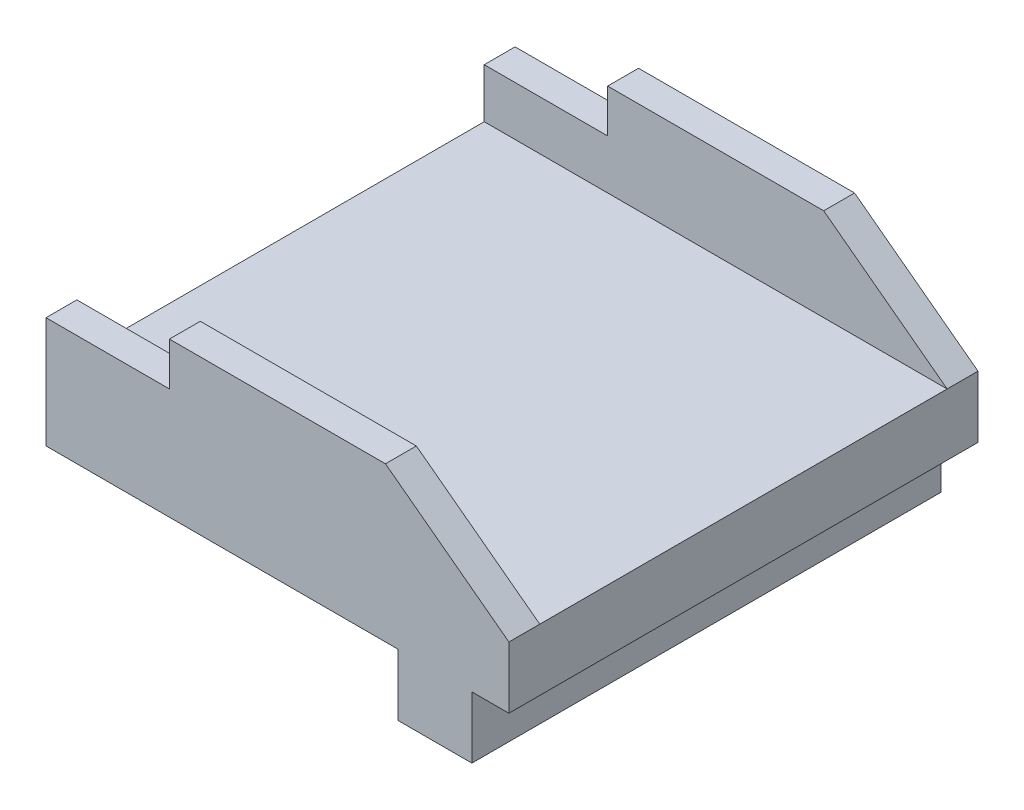
ISO-10303-21;
HEADER;
FILE_DESCRIPTION(('STEP AP214'),'2;1');
FILE_NAME('part.step','',(''),(''),'','','');
FILE_SCHEMA(('AUTOMOTIVE_DESIGN { 1 0 10303 214 1 1 1 1 }'));
ENDSEC;
DATA;
#1=APPLICATION_CONTEXT('core data for automotive mechanical design processes');
#2=APPLICATION_PROTOCOL_DEFINITION('international standard','automotive_design',2000,#1);
#3=PRODUCT_CONTEXT('',#1,'mechanical');
#4=PRODUCT('Part','Part','',(#3));
#5=PRODUCT_RELATED_PRODUCT_CATEGORY('part','',(#4));
#6=PRODUCT_DEFINITION_FORMATION('','',#4);
#7=PRODUCT_DEFINITION_CONTEXT('part definition',#1,'design');
#8=PRODUCT_DEFINITION('design','',#6,#7);
#9=PRODUCT_DEFINITION_SHAPE('','',#8);
#10=(LENGTH_UNIT() NAMED_UNIT(*) SI_UNIT(.MILLI.,.METRE.));
#11=(NAMED_UNIT(*) PLANE_ANGLE_UNIT() SI_UNIT($,.RADIAN.));
#12=(NAMED_UNIT(*) SI_UNIT($,.STERADIAN.) SOLID_ANGLE_UNIT());
#13=UNCERTAINTY_MEASURE_WITH_UNIT(LENGTH_MEASURE(1.E-05),#10,'distance_accuracy_value','');
#14=(GEOMETRIC_REPRESENTATION_CONTEXT(3) GLOBAL_UNCERTAINTY_ASSIGNED_CONTEXT((#13)) GLOBAL_UNIT_ASSIGNED_CONTEXT((#10,
#11,#12)) REPRESENTATION_CONTEXT('',''));
#15=CARTESIAN_POINT('',(0.,0.,0.));
#16=DIRECTION('',(0.,0.,1.));
#17=DIRECTION('',(1.,0.,0.));
#18=AXIS2_PLACEMENT_3D('',#15,#16,#17);
#19=CARTESIAN_POINT('',(14.7,19.6,76.0000000000001));
#20=DIRECTION('',(0.6,0.8,0.));
#21=DIRECTION('',(-0.8,0.6,0.));
#22=AXIS2_PLACEMENT_3D('',#19,#20,#21);
#23=PLANE('',#22);
#24=DIRECTION('',(-0.8,0.6,0.));
#25=VECTOR('',#24,1.);
#26=CARTESIAN_POINT('',(14.7,19.6,5.));
#27=LINE('',#26,#25);
#28=CARTESIAN_POINT('',(37.5,2.5,5.));
#29=VERTEX_POINT('',#28);
#30=CARTESIAN_POINT('',(17.5,17.5,5.));
#31=VERTEX_POINT('',#30);
#32=EDGE_CURVE('E171',#29,#31,#27,.T.);
#33=ORIENTED_EDGE('',*,*,#32,.F.);
#34=DIRECTION('',(0.,0.,-1.));
#35=VECTOR('',#34,1.);
#36=CARTESIAN_POINT('',(37.5,2.5,76.0000000000001));
#37=LINE('',#36,#35);
#38=CARTESIAN_POINT('',(37.5,2.5,0.));
#39=VERTEX_POINT('',#38);
#40=EDGE_CURVE('E215',#29,#39,#37,.T.);
#41=ORIENTED_EDGE('',*,*,#40,.T.);
#42=DIRECTION('',(0.8,-0.6,0.));
#43=VECTOR('',#42,1.);
#44=CARTESIAN_POINT('',(14.7,19.6,0.));
#45=LINE('',#44,#43);
#46=CARTESIAN_POINT('',(17.5,17.5,0.));
#47=VERTEX_POINT('',#46);
#48=EDGE_CURVE('E180',#47,#39,#45,.T.);
#49=ORIENTED_EDGE('',*,*,#48,.F.);
#50=DIRECTION('',(0.,0.,-1.));
#51=VECTOR('',#50,1.);
#52=CARTESIAN_POINT('',(17.5,17.5,76.0000000000001));
#53=LINE('',#52,#51);
#54=EDGE_CURVE('E211',#31,#47,#53,.T.);
#55=ORIENTED_EDGE('',*,*,#54,.F.);
#56=EDGE_LOOP('',(#33,#41,#49,#55));
#57=FACE_BOUND('',#56,.T.);
#58=ADVANCED_FACE('F36',(#57),#23,.T.);
#59=CARTESIAN_POINT('',(0.,17.5,76.0000000000001));
#60=DIRECTION('',(0.,1.,0.));
#61=DIRECTION('',(0.,0.,1.));
#62=AXIS2_PLACEMENT_3D('',#59,#60,#61);
#63=PLANE('',#62);
#64=DIRECTION('',(1.,0.,0.));
#65=VECTOR('',#64,1.);
#66=CARTESIAN_POINT('',(-37.5,17.5,5.));
#67=LINE('',#66,#65);
#68=CARTESIAN_POINT('',(-17.5,17.5,5.));
#69=VERTEX_POINT('',#68);
#70=EDGE_CURVE('E250',#69,#31,#67,.T.);
#71=ORIENTED_EDGE('',*,*,#70,.T.);
#72=ORIENTED_EDGE('',*,*,#54,.T.);
#73=DIRECTION('',(1.,0.,0.));
#74=VECTOR('',#73,1.);
#75=CARTESIAN_POINT('',(0.,17.5,0.));
#76=LINE('',#75,#74);
#77=CARTESIAN_POINT('',(-17.5,17.5,0.));
#78=VERTEX_POINT('',#77);
#79=EDGE_CURVE('E183',#78,#47,#76,.T.);
#80=ORIENTED_EDGE('',*,*,#79,.F.);
#81=DIRECTION('',(0.,0.,-1.));
#82=VECTOR('',#81,1.);
#83=CARTESIAN_POINT('',(-17.5,17.5,76.0000000000001));
#84=LINE('',#83,#82);
#85=EDGE_CURVE('E207',#69,#78,#84,.T.);
#86=ORIENTED_EDGE('',*,*,#85,.F.);
#87=EDGE_LOOP('',(#71,#72,#80,#86));
#88=FACE_BOUND('',#87,.T.);
#89=ADVANCED_FACE('F247',(#88),#63,.T.);
#90=CARTESIAN_POINT('',(-17.5,0.,76.0000000000001));
#91=DIRECTION('',(1.,0.,0.));
#92=DIRECTION('',(0.,1.,0.));
#93=AXIS2_PLACEMENT_3D('',#90,#91,#92);
#94=PLANE('',#93);
#95=DIRECTION('',(0.,0.,-1.));
#96=VECTOR('',#95,1.);
#97=CARTESIAN_POINT('',(-17.5,10.5,76.0000000000001));
#98=LINE('',#97,#96);
#99=CARTESIAN_POINT('',(-17.5,10.5,5.));
#100=VERTEX_POINT('',#99);
#101=CARTESIAN_POINT('',(-17.5,10.5,0.));
#102=VERTEX_POINT('',#101);
#103=EDGE_CURVE('E203',#100,#102,#98,.T.);
#104=ORIENTED_EDGE('',*,*,#103,.F.);
#105=DIRECTION('',(0.,1.,0.));
#106=VECTOR('',#105,1.);
#107=CARTESIAN_POINT('',(-17.5,0.,5.));
#108=LINE('',#107,#106);
#109=EDGE_CURVE('E244',#100,#69,#108,.T.);
#110=ORIENTED_EDGE('',*,*,#109,.T.);
#111=ORIENTED_EDGE('',*,*,#85,.T.);
#112=DIRECTION('',(0.,-1.,0.));
#113=VECTOR('',#112,1.);
#114=CARTESIAN_POINT('',(-17.5,0.,0.));
#115=LINE('',#114,#113);
#116=EDGE_CURVE('E186',#78,#102,#115,.T.);
#117=ORIENTED_EDGE('',*,*,#116,.T.);
#118=EDGE_LOOP('',(#104,#110,#111,#117));
#119=FACE_BOUND('',#118,.T.);
#120=ADVANCED_FACE('F240',(#119),#94,.F.);
#121=CARTESIAN_POINT('',(0.,10.5,76.0000000000001));
#122=DIRECTION('',(0.,1.,0.));
#123=DIRECTION('',(0.,0.,1.));
#124=AXIS2_PLACEMENT_3D('',#121,#122,#123);
#125=PLANE('',#124);
#126=DIRECTION('',(-1.,0.,0.));
#127=VECTOR('',#126,1.);
#128=CARTESIAN_POINT('',(0.,10.5,5.));
#129=LINE('',#128,#127);
#130=CARTESIAN_POINT('',(-37.5,10.5,5.));
#131=VERTEX_POINT('',#130);
#132=EDGE_CURVE('E237',#100,#131,#129,.T.);
#133=ORIENTED_EDGE('',*,*,#132,.F.);
#134=ORIENTED_EDGE('',*,*,#103,.T.);
#135=DIRECTION('',(1.,0.,0.));
#136=VECTOR('',#135,1.);
#137=CARTESIAN_POINT('',(0.,10.5,0.));
#138=LINE('',#137,#136);
#139=CARTESIAN_POINT('',(-37.5,10.5,0.));
#140=VERTEX_POINT('',#139);
#141=EDGE_CURVE('E189',#140,#102,#138,.T.);
#142=ORIENTED_EDGE('',*,*,#141,.F.);
#143=DIRECTION('',(0.,0.,-1.));
#144=VECTOR('',#143,1.);
#145=CARTESIAN_POINT('',(-37.5,10.5,76.0000000000001));
#146=LINE('',#145,#144);
#147=EDGE_CURVE('E148',#131,#140,#146,.T.);
#148=ORIENTED_EDGE('',*,*,#147,.F.);
#149=EDGE_LOOP('',(#133,#134,#142,#148));
#150=FACE_BOUND('',#149,.T.);
#151=ADVANCED_FACE('F233',(#150),#125,.T.);
#152=CARTESIAN_POINT('',(0.,-17.5,76.0000000000001));
#153=DIRECTION('',(0.,1.,0.));
#154=DIRECTION('',(-1.,0.,0.));
#155=AXIS2_PLACEMENT_3D('',#152,#153,#154);
#156=PLANE('',#155);
#157=DIRECTION('',(1.,0.,0.));
#158=VECTOR('',#157,1.);
#159=CARTESIAN_POINT('',(0.,-17.5,0.));
#160=LINE('',#159,#158);
#161=CARTESIAN_POINT('',(19.5,-17.5,0.));
#162=VERTEX_POINT('',#161);
#163=CARTESIAN_POINT('',(31.5,-17.5,0.));
#164=VERTEX_POINT('',#163);
#165=EDGE_CURVE('E168',#162,#164,#160,.T.);
#166=ORIENTED_EDGE('',*,*,#165,.T.);
#167=DIRECTION('',(0.,0.,-1.));
#168=VECTOR('',#167,1.);
#169=CARTESIAN_POINT('',(31.5,-17.5,76.0000000000001));
#170=LINE('',#169,#168);
#171=CARTESIAN_POINT('',(31.5,-17.5,76.0000000000001));
#172=VERTEX_POINT('',#171);
#173=EDGE_CURVE('E44',#172,#164,#170,.T.);
#174=ORIENTED_EDGE('',*,*,#173,.F.);
#175=DIRECTION('',(1.,0.,0.));
#176=VECTOR('',#175,1.);
#177=CARTESIAN_POINT('',(0.,-17.5,76.0000000000001));
#178=LINE('',#177,#176);
#179=CARTESIAN_POINT('',(19.5,-17.5,76.0000000000001));
#180=VERTEX_POINT('',#179);
#181=EDGE_CURVE('E198',#180,#172,#178,.T.);
#182=ORIENTED_EDGE('',*,*,#181,.F.);
#183=DIRECTION('',(0.,0.,-1.));
#184=VECTOR('',#183,1.);
#185=CARTESIAN_POINT('',(19.5,-17.5,76.0000000000001));
#186=LINE('',#185,#184);
#187=EDGE_CURVE('E60',#180,#162,#186,.T.);
#188=ORIENTED_EDGE('',*,*,#187,.T.);
#189=EDGE_LOOP('',(#166,#174,#182,#188));
#190=FACE_BOUND('',#189,.T.);
#191=ADVANCED_FACE('F38',(#190),#156,.F.);
#192=CARTESIAN_POINT('',(31.5,0.,76.0000000000001));
#193=DIRECTION('',(-1.,0.,0.));
#194=DIRECTION('',(0.,0.,1.));
#195=AXIS2_PLACEMENT_3D('',#192,#193,#194);
#196=PLANE('',#195);
#197=DIRECTION('',(0.,1.,0.));
#198=VECTOR('',#197,1.);
#199=CARTESIAN_POINT('',(31.5,0.,0.));
#200=LINE('',#199,#198);
#201=CARTESIAN_POINT('',(31.5,-7.50000000000001,0.));
#202=VERTEX_POINT('',#201);
#203=EDGE_CURVE('E170',#164,#202,#200,.T.);
#204=ORIENTED_EDGE('',*,*,#203,.T.);
#205=DIRECTION('',(0.,0.,-1.));
#206=VECTOR('',#205,1.);
#207=CARTESIAN_POINT('',(31.5,-7.50000000000001,76.0000000000001));
#208=LINE('',#207,#206);
#209=CARTESIAN_POINT('',(31.5,-7.50000000000001,76.0000000000001));
#210=VERTEX_POINT('',#209);
#211=EDGE_CURVE('E221',#210,#202,#208,.T.);
#212=ORIENTED_EDGE('',*,*,#211,.F.);
#213=DIRECTION('',(0.,1.,0.));
#214=VECTOR('',#213,1.);
#215=CARTESIAN_POINT('',(31.5,0.,76.0000000000001));
#216=LINE('',#215,#214);
#217=EDGE_CURVE('E109',#172,#210,#216,.T.);
#218=ORIENTED_EDGE('',*,*,#217,.F.);
#219=ORIENTED_EDGE('',*,*,#173,.T.);
#220=EDGE_LOOP('',(#204,#212,#218,#219));
#221=FACE_BOUND('',#220,.T.);
#222=ADVANCED_FACE('F223',(#221),#196,.F.);
#223=CARTESIAN_POINT('',(0.,-7.50000000000001,76.0000000000001));
#224=DIRECTION('',(0.,-1.,0.));
#225=DIRECTION('',(0.,0.,-1.));
#226=AXIS2_PLACEMENT_3D('',#223,#224,#225);
#227=PLANE('',#226);
#228=DIRECTION('',(-1.,0.,0.));
#229=VECTOR('',#228,1.);
#230=CARTESIAN_POINT('',(0.,-7.50000000000001,0.));
#231=LINE('',#230,#229);
#232=CARTESIAN_POINT('',(37.5,-7.50000000000001,0.));
#233=VERTEX_POINT('',#232);
#234=EDGE_CURVE('E174',#233,#202,#231,.T.);
#235=ORIENTED_EDGE('',*,*,#234,.F.);
#236=DIRECTION('',(0.,0.,-1.));
#237=VECTOR('',#236,1.);
#238=CARTESIAN_POINT('',(37.5,-7.50000000000001,76.0000000000001));
#239=LINE('',#238,#237);
#240=CARTESIAN_POINT('',(37.5,-7.50000000000001,76.0000000000001));
#241=VERTEX_POINT('',#240);
#242=EDGE_CURVE('E219',#241,#233,#239,.T.);
#243=ORIENTED_EDGE('',*,*,#242,.F.);
#244=DIRECTION('',(-1.,0.,0.));
#245=VECTOR('',#244,1.);
#246=CARTESIAN_POINT('',(0.,-7.50000000000001,76.0000000000001));
#247=LINE('',#246,#245);
#248=EDGE_CURVE('E307',#241,#210,#247,.T.);
#249=ORIENTED_EDGE('',*,*,#248,.T.);
#250=ORIENTED_EDGE('',*,*,#211,.T.);
#251=EDGE_LOOP('',(#235,#243,#249,#250));
#252=FACE_BOUND('',#251,.T.);
#253=ADVANCED_FACE('F356',(#252),#227,.T.);
#254=CARTESIAN_POINT('',(37.5,0.,76.0000000000001));
#255=DIRECTION('',(-1.,0.,0.));
#256=DIRECTION('',(0.,0.,1.));
#257=AXIS2_PLACEMENT_3D('',#254,#255,#256);
#258=PLANE('',#257);
#259=DIRECTION('',(0.,1.,0.));
#260=VECTOR('',#259,1.);
#261=CARTESIAN_POINT('',(37.5,0.,0.));
#262=LINE('',#261,#260);
#263=EDGE_CURVE('E177',#233,#39,#262,.T.);
#264=ORIENTED_EDGE('',*,*,#263,.T.);
#265=ORIENTED_EDGE('',*,*,#40,.F.);
#266=DIRECTION('',(0.,0.,-1.));
#267=VECTOR('',#266,1.);
#268=CARTESIAN_POINT('',(37.5,2.5,71.));
#269=LINE('',#268,#267);
#270=CARTESIAN_POINT('',(37.5,2.5,71.));
#271=VERTEX_POINT('',#270);
#272=EDGE_CURVE('E280',#271,#29,#269,.T.);
#273=ORIENTED_EDGE('',*,*,#272,.F.);
#274=CARTESIAN_POINT('',(37.5,2.5,76.0000000000001));
#275=VERTEX_POINT('',#274);
#276=EDGE_CURVE('E216',#275,#271,#37,.T.);
#277=ORIENTED_EDGE('',*,*,#276,.F.);
#278=DIRECTION('',(0.,1.,0.));
#279=VECTOR('',#278,1.);
#280=CARTESIAN_POINT('',(37.5,0.,76.0000000000001));
#281=LINE('',#280,#279);
#282=EDGE_CURVE('E310',#241,#275,#281,.T.);
#283=ORIENTED_EDGE('',*,*,#282,.F.);
#284=ORIENTED_EDGE('',*,*,#242,.T.);
#285=EDGE_LOOP('',(#264,#265,#273,#277,#283,#284));
#286=FACE_BOUND('',#285,.T.);
#287=ADVANCED_FACE('F333',(#286),#258,.F.);
#288=DIRECTION('',(0.8,-0.6,0.));
#289=VECTOR('',#288,1.);
#290=CARTESIAN_POINT('',(14.7,19.6,71.0000000000001));
#291=LINE('',#290,#289);
#292=CARTESIAN_POINT('',(17.5,17.5,71.0000000000001));
#293=VERTEX_POINT('',#292);
#294=EDGE_CURVE('E300',#293,#271,#291,.T.);
#295=ORIENTED_EDGE('',*,*,#294,.F.);
#296=CARTESIAN_POINT('',(17.5,17.5,76.0000000000001));
#297=VERTEX_POINT('',#296);
#298=EDGE_CURVE('E212',#297,#293,#53,.T.);
#299=ORIENTED_EDGE('',*,*,#298,.F.);
#300=DIRECTION('',(0.8,-0.6,0.));
#301=VECTOR('',#300,1.);
#302=CARTESIAN_POINT('',(14.7,19.6,76.0000000000001));
#303=LINE('',#302,#301);
#304=EDGE_CURVE('E312',#297,#275,#303,.T.);
#305=ORIENTED_EDGE('',*,*,#304,.T.);
#306=ORIENTED_EDGE('',*,*,#276,.T.);
#307=EDGE_LOOP('',(#295,#299,#305,#306));
#308=FACE_BOUND('',#307,.T.);
#309=ADVANCED_FACE('F336',(#308),#23,.T.);
#310=DIRECTION('',(1.,0.,0.));
#311=VECTOR('',#310,1.);
#312=CARTESIAN_POINT('',(-37.5,17.5,71.0000000000001));
#313=LINE('',#312,#311);
#314=CARTESIAN_POINT('',(-17.5,17.5,71.0000000000001));
#315=VERTEX_POINT('',#314);
#316=EDGE_CURVE('E290',#315,#293,#313,.T.);
#317=ORIENTED_EDGE('',*,*,#316,.F.);
#318=CARTESIAN_POINT('',(-17.5,17.5,76.0000000000001));
#319=VERTEX_POINT('',#318);
#320=EDGE_CURVE('E208',#319,#315,#84,.T.);
#321=ORIENTED_EDGE('',*,*,#320,.F.);
#322=DIRECTION('',(1.,0.,0.));
#323=VECTOR('',#322,1.);
#324=CARTESIAN_POINT('',(0.,17.5,76.0000000000001));
#325=LINE('',#324,#323);
#326=EDGE_CURVE('E315',#319,#297,#325,.T.);
#327=ORIENTED_EDGE('',*,*,#326,.T.);
#328=ORIENTED_EDGE('',*,*,#298,.T.);
#329=EDGE_LOOP('',(#317,#321,#327,#328));
#330=FACE_BOUND('',#329,.T.);
#331=ADVANCED_FACE('F339',(#330),#63,.T.);
#332=ORIENTED_EDGE('',*,*,#320,.T.);
#333=DIRECTION('',(0.,-1.,0.));
#334=VECTOR('',#333,1.);
#335=CARTESIAN_POINT('',(-17.5,0.,71.));
#336=LINE('',#335,#334);
#337=CARTESIAN_POINT('',(-17.5,10.5,71.));
#338=VERTEX_POINT('',#337);
#339=EDGE_CURVE('E297',#315,#338,#336,.T.);
#340=ORIENTED_EDGE('',*,*,#339,.T.);
#341=CARTESIAN_POINT('',(-17.5,10.5,76.0000000000001));
#342=VERTEX_POINT('',#341);
#343=EDGE_CURVE('E204',#342,#338,#98,.T.);
#344=ORIENTED_EDGE('',*,*,#343,.F.);
#345=DIRECTION('',(0.,-1.,0.));
#346=VECTOR('',#345,1.);
#347=CARTESIAN_POINT('',(-17.5,0.,76.0000000000001));
#348=LINE('',#347,#346);
#349=EDGE_CURVE('E163',#319,#342,#348,.T.);
#350=ORIENTED_EDGE('',*,*,#349,.F.);
#351=EDGE_LOOP('',(#332,#340,#344,#350));
#352=FACE_BOUND('',#351,.T.);
#353=ADVANCED_FACE('F322',(#352),#94,.F.);
#354=DIRECTION('',(1.,0.,0.));
#355=VECTOR('',#354,1.);
#356=CARTESIAN_POINT('',(0.,10.5,71.));
#357=LINE('',#356,#355);
#358=CARTESIAN_POINT('',(-37.5,10.5,71.));
#359=VERTEX_POINT('',#358);
#360=EDGE_CURVE('E282',#359,#338,#357,.T.);
#361=ORIENTED_EDGE('',*,*,#360,.F.);
#362=CARTESIAN_POINT('',(-37.5,10.5,76.0000000000001));
#363=VERTEX_POINT('',#362);
#364=EDGE_CURVE('E201',#363,#359,#146,.T.);
#365=ORIENTED_EDGE('',*,*,#364,.F.);
#366=DIRECTION('',(1.,0.,0.));
#367=VECTOR('',#366,1.);
#368=CARTESIAN_POINT('',(0.,10.5,76.0000000000001));
#369=LINE('',#368,#367);
#370=EDGE_CURVE('E161',#363,#342,#369,.T.);
#371=ORIENTED_EDGE('',*,*,#370,.T.);
#372=ORIENTED_EDGE('',*,*,#343,.T.);
#373=EDGE_LOOP('',(#361,#365,#371,#372));
#374=FACE_BOUND('',#373,.T.);
#375=ADVANCED_FACE('F325',(#374),#125,.T.);
#376=CARTESIAN_POINT('',(-37.5,0.,76.0000000000001));
#377=DIRECTION('',(-1.,0.,0.));
#378=DIRECTION('',(0.,-1.,0.));
#379=AXIS2_PLACEMENT_3D('',#376,#377,#378);
#380=PLANE('',#379);
#381=DIRECTION('',(0.,1.,0.));
#382=VECTOR('',#381,1.);
#383=CARTESIAN_POINT('',(-37.5,2.5,5.));
#384=LINE('',#383,#382);
#385=CARTESIAN_POINT('',(-37.5,2.5,5.));
#386=VERTEX_POINT('',#385);
#387=EDGE_CURVE('E285',#386,#131,#384,.T.);
#388=ORIENTED_EDGE('',*,*,#387,.T.);
#389=ORIENTED_EDGE('',*,*,#147,.T.);
#390=DIRECTION('',(0.,1.,0.));
#391=VECTOR('',#390,1.);
#392=CARTESIAN_POINT('',(-37.5,0.,0.));
#393=LINE('',#392,#391);
#394=CARTESIAN_POINT('',(-37.5,-7.50000000000001,0.));
#395=VERTEX_POINT('',#394);
#396=EDGE_CURVE('E144',#395,#140,#393,.T.);
#397=ORIENTED_EDGE('',*,*,#396,.F.);
#398=DIRECTION('',(0.,0.,-1.));
#399=VECTOR('',#398,1.);
#400=CARTESIAN_POINT('',(-37.5,-7.50000000000001,76.0000000000001));
#401=LINE('',#400,#399);
#402=CARTESIAN_POINT('',(-37.5,-7.50000000000001,76.0000000000001));
#403=VERTEX_POINT('',#402);
#404=EDGE_CURVE('E136',#403,#395,#401,.T.);
#405=ORIENTED_EDGE('',*,*,#404,.F.);
#406=DIRECTION('',(0.,1.,0.));
#407=VECTOR('',#406,1.);
#408=CARTESIAN_POINT('',(-37.5,0.,76.0000000000001));
#409=LINE('',#408,#407);
#410=EDGE_CURVE('E142',#403,#363,#409,.T.);
#411=ORIENTED_EDGE('',*,*,#410,.T.);
#412=ORIENTED_EDGE('',*,*,#364,.T.);
#413=DIRECTION('',(0.,1.,0.));
#414=VECTOR('',#413,1.);
#415=CARTESIAN_POINT('',(-37.5,0.,71.));
#416=LINE('',#415,#414);
#417=CARTESIAN_POINT('',(-37.5,2.5,71.));
#418=VERTEX_POINT('',#417);
#419=EDGE_CURVE('E11',#418,#359,#416,.T.);
#420=ORIENTED_EDGE('',*,*,#419,.F.);
#421=DIRECTION('',(0.,0.,-1.));
#422=VECTOR('',#421,1.);
#423=CARTESIAN_POINT('',(-37.5,2.5,71.));
#424=LINE('',#423,#422);
#425=EDGE_CURVE('E51',#418,#386,#424,.T.);
#426=ORIENTED_EDGE('',*,*,#425,.T.);
#427=EDGE_LOOP('',(#388,#389,#397,#405,#411,#412,#420,#426));
#428=FACE_BOUND('',#427,.T.);
#429=ADVANCED_FACE('F139',(#428),#380,.T.);
#430=CARTESIAN_POINT('',(0.,-7.50000000000001,76.0000000000001));
#431=DIRECTION('',(0.,1.,0.));
#432=DIRECTION('',(0.,0.,1.));
#433=AXIS2_PLACEMENT_3D('',#430,#431,#432);
#434=PLANE('',#433);
#435=DIRECTION('',(1.,0.,0.));
#436=VECTOR('',#435,1.);
#437=CARTESIAN_POINT('',(0.,-7.50000000000001,0.));
#438=LINE('',#437,#436);
#439=CARTESIAN_POINT('',(19.5,-7.50000000000001,0.));
#440=VERTEX_POINT('',#439);
#441=EDGE_CURVE('E193',#395,#440,#438,.T.);
#442=ORIENTED_EDGE('',*,*,#441,.T.);
#443=DIRECTION('',(0.,0.,-1.));
#444=VECTOR('',#443,1.);
#445=CARTESIAN_POINT('',(19.5,-7.50000000000001,76.0000000000001));
#446=LINE('',#445,#444);
#447=CARTESIAN_POINT('',(19.5,-7.50000000000001,76.0000000000001));
#448=VERTEX_POINT('',#447);
#449=EDGE_CURVE('E149',#448,#440,#446,.T.);
#450=ORIENTED_EDGE('',*,*,#449,.F.);
#451=DIRECTION('',(1.,0.,0.));
#452=VECTOR('',#451,1.);
#453=CARTESIAN_POINT('',(0.,-7.50000000000001,76.0000000000001));
#454=LINE('',#453,#452);
#455=EDGE_CURVE('E152',#403,#448,#454,.T.);
#456=ORIENTED_EDGE('',*,*,#455,.F.);
#457=ORIENTED_EDGE('',*,*,#404,.T.);
#458=EDGE_LOOP('',(#442,#450,#456,#457));
#459=FACE_BOUND('',#458,.T.);
#460=ADVANCED_FACE('F153',(#459),#434,.F.);
#461=CARTESIAN_POINT('',(19.5,0.,76.0000000000001));
#462=DIRECTION('',(-1.,0.,0.));
#463=DIRECTION('',(0.,-1.,0.));
#464=AXIS2_PLACEMENT_3D('',#461,#462,#463);
#465=PLANE('',#464);
#466=DIRECTION('',(0.,1.,0.));
#467=VECTOR('',#466,1.);
#468=CARTESIAN_POINT('',(19.5,0.,0.));
#469=LINE('',#468,#467);
#470=EDGE_CURVE('E195',#162,#440,#469,.T.);
#471=ORIENTED_EDGE('',*,*,#470,.F.);
#472=ORIENTED_EDGE('',*,*,#187,.F.);
#473=DIRECTION('',(0.,1.,0.));
#474=VECTOR('',#473,1.);
#475=CARTESIAN_POINT('',(19.5,0.,76.0000000000001));
#476=LINE('',#475,#474);
#477=EDGE_CURVE('E156',#180,#448,#476,.T.);
#478=ORIENTED_EDGE('',*,*,#477,.T.);
#479=ORIENTED_EDGE('',*,*,#449,.T.);
#480=EDGE_LOOP('',(#471,#472,#478,#479));
#481=FACE_BOUND('',#480,.T.);
#482=ADVANCED_FACE('F226',(#481),#465,.T.);
#483=CARTESIAN_POINT('',(0.,0.,76.0000000000001));
#484=DIRECTION('',(0.,0.,1.));
#485=DIRECTION('',(1.,0.,0.));
#486=AXIS2_PLACEMENT_3D('',#483,#484,#485);
#487=PLANE('',#486);
#488=ORIENTED_EDGE('',*,*,#181,.T.);
#489=ORIENTED_EDGE('',*,*,#217,.T.);
#490=ORIENTED_EDGE('',*,*,#248,.F.);
#491=ORIENTED_EDGE('',*,*,#282,.T.);
#492=ORIENTED_EDGE('',*,*,#304,.F.);
#493=ORIENTED_EDGE('',*,*,#326,.F.);
#494=ORIENTED_EDGE('',*,*,#349,.T.);
#495=ORIENTED_EDGE('',*,*,#370,.F.);
#496=ORIENTED_EDGE('',*,*,#410,.F.);
#497=ORIENTED_EDGE('',*,*,#455,.T.);
#498=ORIENTED_EDGE('',*,*,#477,.F.);
#499=EDGE_LOOP('',(#488,#489,#490,#491,#492,#493,#494,#495,#496,#497,#498));
#500=FACE_BOUND('',#499,.T.);
#501=ADVANCED_FACE('F159',(#500),#487,.T.);
#502=CARTESIAN_POINT('',(0.,0.,0.));
#503=DIRECTION('',(0.,0.,1.));
#504=DIRECTION('',(1.,0.,0.));
#505=AXIS2_PLACEMENT_3D('',#502,#503,#504);
#506=PLANE('',#505);
#507=ORIENTED_EDGE('',*,*,#165,.F.);
#508=ORIENTED_EDGE('',*,*,#470,.T.);
#509=ORIENTED_EDGE('',*,*,#441,.F.);
#510=ORIENTED_EDGE('',*,*,#396,.T.);
#511=ORIENTED_EDGE('',*,*,#141,.T.);
#512=ORIENTED_EDGE('',*,*,#116,.F.);
#513=ORIENTED_EDGE('',*,*,#79,.T.);
#514=ORIENTED_EDGE('',*,*,#48,.T.);
#515=ORIENTED_EDGE('',*,*,#263,.F.);
#516=ORIENTED_EDGE('',*,*,#234,.T.);
#517=ORIENTED_EDGE('',*,*,#203,.F.);
#518=EDGE_LOOP('',(#507,#508,#509,#510,#511,#512,#513,#514,#515,#516,#517));
#519=FACE_BOUND('',#518,.T.);
#520=ADVANCED_FACE('F225',(#519),#506,.F.);
#521=CARTESIAN_POINT('',(-37.5,2.5,5.));
#522=DIRECTION('',(0.,0.,-1.));
#523=DIRECTION('',(-1.,0.,0.));
#524=AXIS2_PLACEMENT_3D('',#521,#522,#523);
#525=PLANE('',#524);
#526=ORIENTED_EDGE('',*,*,#32,.T.);
#527=ORIENTED_EDGE('',*,*,#70,.F.);
#528=ORIENTED_EDGE('',*,*,#109,.F.);
#529=ORIENTED_EDGE('',*,*,#132,.T.);
#530=ORIENTED_EDGE('',*,*,#387,.F.);
#531=DIRECTION('',(1.,0.,0.));
#532=VECTOR('',#531,1.);
#533=CARTESIAN_POINT('',(-37.5,2.5,5.));
#534=LINE('',#533,#532);
#535=EDGE_CURVE('E276',#386,#29,#534,.T.);
#536=ORIENTED_EDGE('',*,*,#535,.T.);
#537=EDGE_LOOP('',(#526,#527,#528,#529,#530,#536));
#538=FACE_BOUND('',#537,.T.);
#539=ADVANCED_FACE('F286',(#538),#525,.F.);
#540=CARTESIAN_POINT('',(-37.5,2.5,71.));
#541=DIRECTION('',(0.,0.,1.));
#542=DIRECTION('',(0.,-1.,0.));
#543=AXIS2_PLACEMENT_3D('',#540,#541,#542);
#544=PLANE('',#543);
#545=ORIENTED_EDGE('',*,*,#294,.T.);
#546=DIRECTION('',(1.,0.,0.));
#547=VECTOR('',#546,1.);
#548=CARTESIAN_POINT('',(-37.5,2.5,71.));
#549=LINE('',#548,#547);
#550=EDGE_CURVE('E283',#418,#271,#549,.T.);
#551=ORIENTED_EDGE('',*,*,#550,.F.);
#552=ORIENTED_EDGE('',*,*,#419,.T.);
#553=ORIENTED_EDGE('',*,*,#360,.T.);
#554=ORIENTED_EDGE('',*,*,#339,.F.);
#555=ORIENTED_EDGE('',*,*,#316,.T.);
#556=EDGE_LOOP('',(#545,#551,#552,#553,#554,#555));
#557=FACE_BOUND('',#556,.T.);
#558=ADVANCED_FACE('F327',(#557),#544,.F.);
#559=CARTESIAN_POINT('',(-37.5,2.5,71.));
#560=DIRECTION('',(0.,-1.,0.));
#561=DIRECTION('',(0.,0.,-1.));
#562=AXIS2_PLACEMENT_3D('',#559,#560,#561);
#563=PLANE('',#562);
#564=ORIENTED_EDGE('',*,*,#272,.T.);
#565=ORIENTED_EDGE('',*,*,#535,.F.);
#566=ORIENTED_EDGE('',*,*,#425,.F.);
#567=ORIENTED_EDGE('',*,*,#550,.T.);
#568=EDGE_LOOP('',(#564,#565,#566,#567));
#569=FACE_BOUND('',#568,.T.);
#570=ADVANCED_FACE('F278',(#569),#563,.F.);
#571=CLOSED_SHELL('',(#58,#89,#120,#151,#191,#222,#253,#287,#309,#331,#353,#375,#429,#460,#482,
#501,#520,#539,#558,#570));
#572=MANIFOLD_SOLID_BREP('B2',#571);
#573=ADVANCED_BREP_SHAPE_REPRESENTATION('',(#18,#572),#14);
#574=SHAPE_DEFINITION_REPRESENTATION(#9,#573);
ENDSEC;
END-ISO-10303-21;
